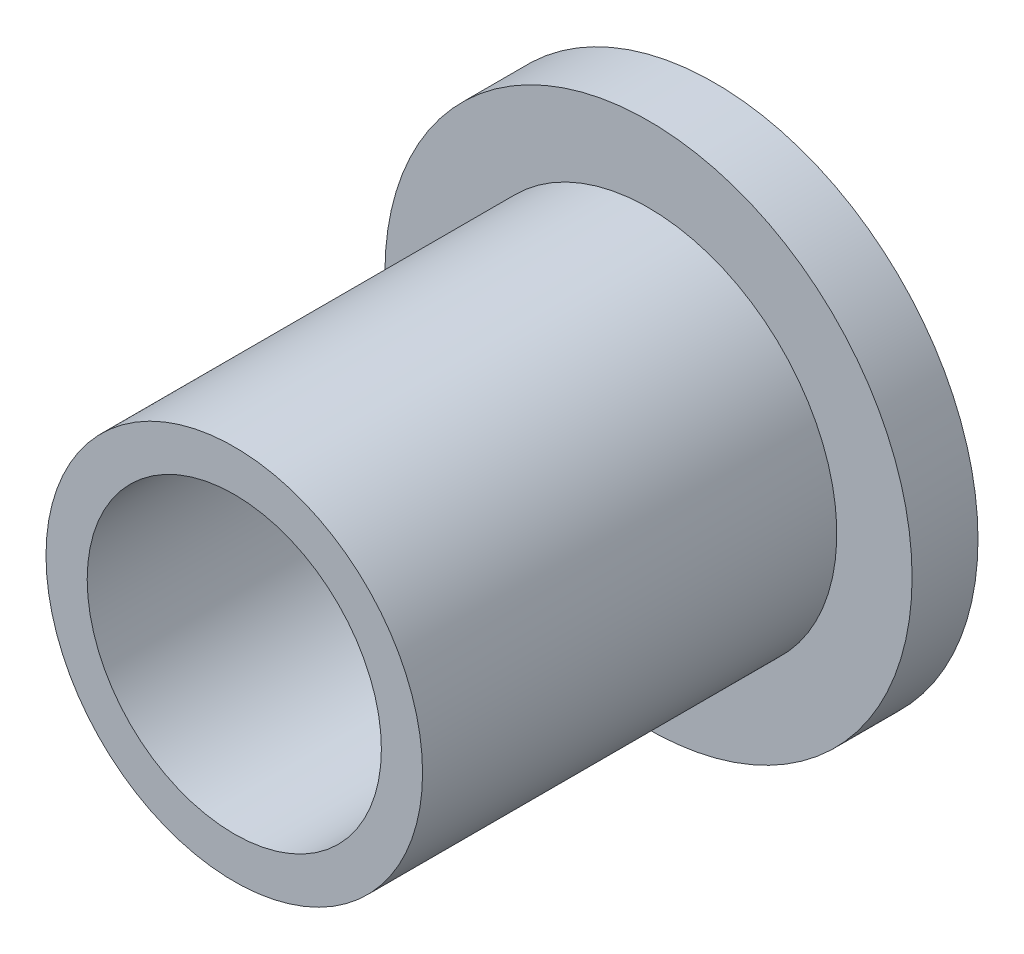
ISO-10303-21;
HEADER;
FILE_DESCRIPTION(('STEP AP214'),'2;1');
FILE_NAME('part.step','',(''),(''),'','','');
FILE_SCHEMA(('AUTOMOTIVE_DESIGN { 1 0 10303 214 1 1 1 1 }'));
ENDSEC;
DATA;
#1=APPLICATION_CONTEXT('core data for automotive mechanical design processes');
#2=APPLICATION_PROTOCOL_DEFINITION('international standard','automotive_design',2000,#1);
#3=PRODUCT_CONTEXT('',#1,'mechanical');
#4=PRODUCT('Part','Part','',(#3));
#5=PRODUCT_RELATED_PRODUCT_CATEGORY('part','',(#4));
#6=PRODUCT_DEFINITION_FORMATION('','',#4);
#7=PRODUCT_DEFINITION_CONTEXT('part definition',#1,'design');
#8=PRODUCT_DEFINITION('design','',#6,#7);
#9=PRODUCT_DEFINITION_SHAPE('','',#8);
#10=(LENGTH_UNIT() NAMED_UNIT(*) SI_UNIT(.MILLI.,.METRE.));
#11=(NAMED_UNIT(*) PLANE_ANGLE_UNIT() SI_UNIT($,.RADIAN.));
#12=(NAMED_UNIT(*) SI_UNIT($,.STERADIAN.) SOLID_ANGLE_UNIT());
#13=UNCERTAINTY_MEASURE_WITH_UNIT(LENGTH_MEASURE(1.E-05),#10,'distance_accuracy_value','');
#14=(GEOMETRIC_REPRESENTATION_CONTEXT(3) GLOBAL_UNCERTAINTY_ASSIGNED_CONTEXT((#13)) GLOBAL_UNIT_ASSIGNED_CONTEXT((#10,
#11,#12)) REPRESENTATION_CONTEXT('',''));
#15=CARTESIAN_POINT('',(0.,0.,0.));
#16=DIRECTION('',(0.,0.,1.));
#17=DIRECTION('',(1.,0.,0.));
#18=AXIS2_PLACEMENT_3D('',#15,#16,#17);
#19=CARTESIAN_POINT('',(0.,0.,11.176));
#20=DIRECTION('',(0.,0.,1.));
#21=DIRECTION('',(1.,0.,0.));
#22=AXIS2_PLACEMENT_3D('',#19,#20,#21);
#23=PLANE('',#22);
#24=CARTESIAN_POINT('',(0.,0.,11.176));
#25=DIRECTION('',(0.,0.,1.));
#26=DIRECTION('',(1.,0.,0.));
#27=AXIS2_PLACEMENT_3D('',#24,#25,#26);
#28=CIRCLE('',#27,5.08);
#29=CARTESIAN_POINT('',(5.08,0.,11.176));
#30=VERTEX_POINT('',#29);
#31=EDGE_CURVE('E10',#30,#30,#28,.T.);
#32=ORIENTED_EDGE('',*,*,#31,.T.);
#33=EDGE_LOOP('',(#32));
#34=FACE_BOUND('',#33,.T.);
#35=CARTESIAN_POINT('',(0.,0.,11.176));
#36=DIRECTION('',(0.,0.,1.));
#37=DIRECTION('',(1.,0.,0.));
#38=AXIS2_PLACEMENT_3D('',#35,#36,#37);
#39=CIRCLE('',#38,3.96875);
#40=CARTESIAN_POINT('',(3.96875,0.,11.176));
#41=VERTEX_POINT('',#40);
#42=EDGE_CURVE('E35',#41,#41,#39,.T.);
#43=ORIENTED_EDGE('',*,*,#42,.F.);
#44=EDGE_LOOP('',(#43));
#45=FACE_BOUND('',#44,.T.);
#46=ADVANCED_FACE('F28',(#34,#45),#23,.T.);
#47=CARTESIAN_POINT('',(0.,0.,0.));
#48=DIRECTION('',(0.,0.,1.));
#49=DIRECTION('',(1.,0.,0.));
#50=AXIS2_PLACEMENT_3D('',#47,#48,#49);
#51=PLANE('',#50);
#52=CARTESIAN_POINT('',(0.,0.,0.));
#53=DIRECTION('',(0.,0.,-1.));
#54=DIRECTION('',(-1.,0.,0.));
#55=AXIS2_PLACEMENT_3D('',#52,#53,#54);
#56=CIRCLE('',#55,4.0005);
#57=CARTESIAN_POINT('',(-4.0005,0.,0.));
#58=VERTEX_POINT('',#57);
#59=EDGE_CURVE('E55',#58,#58,#56,.T.);
#60=ORIENTED_EDGE('',*,*,#59,.T.);
#61=EDGE_LOOP('',(#60));
#62=FACE_BOUND('',#61,.T.);
#63=CARTESIAN_POINT('',(0.,0.,0.));
#64=DIRECTION('',(0.,0.,1.));
#65=DIRECTION('',(1.,0.,0.));
#66=AXIS2_PLACEMENT_3D('',#63,#64,#65);
#67=CIRCLE('',#66,3.96875);
#68=CARTESIAN_POINT('',(3.96875,0.,0.));
#69=VERTEX_POINT('',#68);
#70=EDGE_CURVE('E39',#69,#69,#67,.T.);
#71=ORIENTED_EDGE('',*,*,#70,.T.);
#72=EDGE_LOOP('',(#71));
#73=FACE_BOUND('',#72,.T.);
#74=ADVANCED_FACE('F81',(#62,#73),#51,.F.);
#75=CARTESIAN_POINT('',(0.,0.,11.176));
#76=DIRECTION('',(0.,0.,-1.));
#77=DIRECTION('',(-1.,0.,0.));
#78=AXIS2_PLACEMENT_3D('',#75,#76,#77);
#79=CYLINDRICAL_SURFACE('',#78,5.08);
#80=ORIENTED_EDGE('',*,*,#31,.F.);
#81=EDGE_LOOP('',(#80));
#82=FACE_BOUND('',#81,.T.);
#83=CARTESIAN_POINT('',(0.,0.,0.));
#84=DIRECTION('',(0.,0.,-1.));
#85=DIRECTION('',(-1.,0.,0.));
#86=AXIS2_PLACEMENT_3D('',#83,#84,#85);
#87=CIRCLE('',#86,5.08);
#88=CARTESIAN_POINT('',(-5.08,0.,0.));
#89=VERTEX_POINT('',#88);
#90=EDGE_CURVE('E44',#89,#89,#87,.T.);
#91=ORIENTED_EDGE('',*,*,#90,.F.);
#92=EDGE_LOOP('',(#91));
#93=FACE_BOUND('',#92,.T.);
#94=ADVANCED_FACE('F30',(#82,#93),#79,.T.);
#95=CARTESIAN_POINT('',(0.,0.,11.176));
#96=DIRECTION('',(0.,0.,-1.));
#97=DIRECTION('',(-1.,0.,0.));
#98=AXIS2_PLACEMENT_3D('',#95,#96,#97);
#99=CYLINDRICAL_SURFACE('',#98,3.96875);
#100=ORIENTED_EDGE('',*,*,#42,.T.);
#101=EDGE_LOOP('',(#100));
#102=FACE_BOUND('',#101,.T.);
#103=ORIENTED_EDGE('',*,*,#70,.F.);
#104=EDGE_LOOP('',(#103));
#105=FACE_BOUND('',#104,.T.);
#106=ADVANCED_FACE('F76',(#102,#105),#99,.F.);
#107=CARTESIAN_POINT('',(0.,0.,0.));
#108=DIRECTION('',(0.,0.,-1.));
#109=DIRECTION('',(-1.,0.,0.));
#110=AXIS2_PLACEMENT_3D('',#107,#108,#109);
#111=PLANE('',#110);
#112=CARTESIAN_POINT('',(0.,0.,0.));
#113=DIRECTION('',(0.,0.,-1.));
#114=DIRECTION('',(-1.,0.,0.));
#115=AXIS2_PLACEMENT_3D('',#112,#113,#114);
#116=CIRCLE('',#115,7.112);
#117=CARTESIAN_POINT('',(-7.112,0.,0.));
#118=VERTEX_POINT('',#117);
#119=EDGE_CURVE('E49',#118,#118,#116,.T.);
#120=ORIENTED_EDGE('',*,*,#119,.F.);
#121=EDGE_LOOP('',(#120));
#122=FACE_BOUND('',#121,.T.);
#123=ORIENTED_EDGE('',*,*,#90,.T.);
#124=EDGE_LOOP('',(#123));
#125=FACE_BOUND('',#124,.T.);
#126=ADVANCED_FACE('F67',(#122,#125),#111,.F.);
#127=CARTESIAN_POINT('',(0.,0.,-1.778));
#128=DIRECTION('',(0.,0.,-1.));
#129=DIRECTION('',(-1.,0.,0.));
#130=AXIS2_PLACEMENT_3D('',#127,#128,#129);
#131=PLANE('',#130);
#132=CARTESIAN_POINT('',(0.,0.,-1.778));
#133=DIRECTION('',(0.,0.,-1.));
#134=DIRECTION('',(-1.,0.,0.));
#135=AXIS2_PLACEMENT_3D('',#132,#133,#134);
#136=CIRCLE('',#135,7.112);
#137=CARTESIAN_POINT('',(-7.112,0.,-1.778));
#138=VERTEX_POINT('',#137);
#139=EDGE_CURVE('E48',#138,#138,#136,.T.);
#140=ORIENTED_EDGE('',*,*,#139,.T.);
#141=EDGE_LOOP('',(#140));
#142=FACE_BOUND('',#141,.T.);
#143=CARTESIAN_POINT('',(0.,0.,-1.778));
#144=DIRECTION('',(0.,0.,-1.));
#145=DIRECTION('',(-1.,0.,0.));
#146=AXIS2_PLACEMENT_3D('',#143,#144,#145);
#147=CIRCLE('',#146,4.0005);
#148=CARTESIAN_POINT('',(-4.0005,0.,-1.778));
#149=VERTEX_POINT('',#148);
#150=EDGE_CURVE('E52',#149,#149,#147,.T.);
#151=ORIENTED_EDGE('',*,*,#150,.F.);
#152=EDGE_LOOP('',(#151));
#153=FACE_BOUND('',#152,.T.);
#154=ADVANCED_FACE('F64',(#142,#153),#131,.T.);
#155=CARTESIAN_POINT('',(0.,0.,-1.778));
#156=DIRECTION('',(0.,0.,1.));
#157=DIRECTION('',(1.,0.,0.));
#158=AXIS2_PLACEMENT_3D('',#155,#156,#157);
#159=CYLINDRICAL_SURFACE('',#158,7.112);
#160=ORIENTED_EDGE('',*,*,#139,.F.);
#161=EDGE_LOOP('',(#160));
#162=FACE_BOUND('',#161,.T.);
#163=ORIENTED_EDGE('',*,*,#119,.T.);
#164=EDGE_LOOP('',(#163));
#165=FACE_BOUND('',#164,.T.);
#166=ADVANCED_FACE('F66',(#162,#165),#159,.T.);
#167=CARTESIAN_POINT('',(0.,0.,-1.778));
#168=DIRECTION('',(0.,0.,1.));
#169=DIRECTION('',(1.,0.,0.));
#170=AXIS2_PLACEMENT_3D('',#167,#168,#169);
#171=CYLINDRICAL_SURFACE('',#170,4.0005);
#172=ORIENTED_EDGE('',*,*,#150,.T.);
#173=EDGE_LOOP('',(#172));
#174=FACE_BOUND('',#173,.T.);
#175=ORIENTED_EDGE('',*,*,#59,.F.);
#176=EDGE_LOOP('',(#175));
#177=FACE_BOUND('',#176,.T.);
#178=ADVANCED_FACE('F61',(#174,#177),#171,.F.);
#179=CLOSED_SHELL('',(#46,#74,#94,#106,#126,#154,#166,#178));
#180=MANIFOLD_SOLID_BREP('B2',#179);
#181=ADVANCED_BREP_SHAPE_REPRESENTATION('',(#18,#180),#14);
#182=SHAPE_DEFINITION_REPRESENTATION(#9,#181);
ENDSEC;
END-ISO-10303-21;
